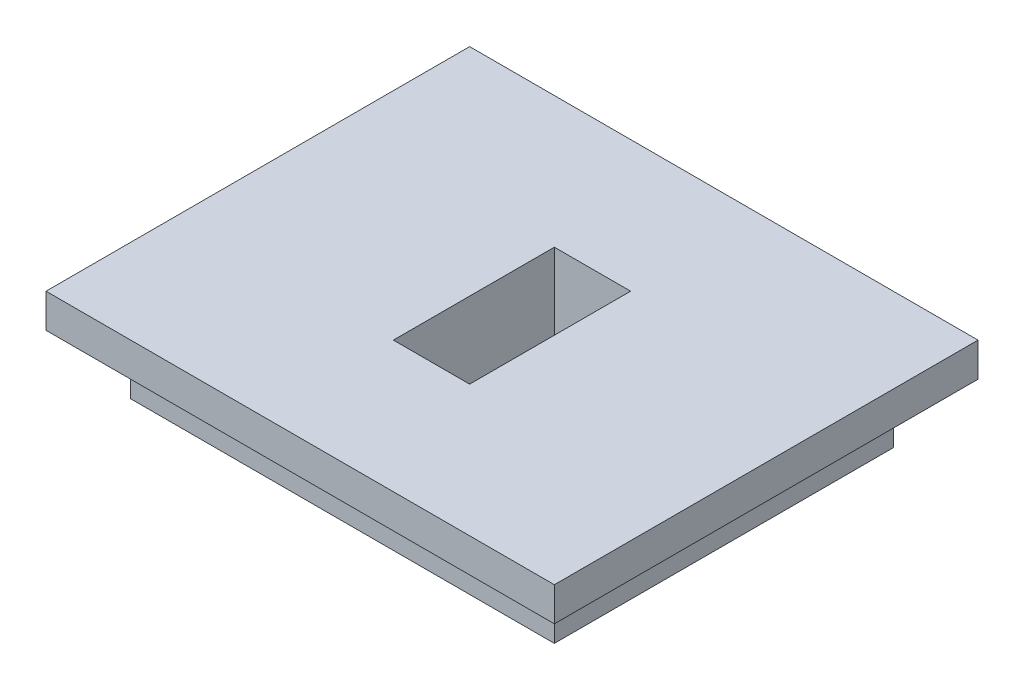
ISO-10303-21;
HEADER;
FILE_DESCRIPTION(('STEP AP214'),'2;1');
FILE_NAME('part.step','',(''),(''),'','','');
FILE_SCHEMA(('AUTOMOTIVE_DESIGN { 1 0 10303 214 1 1 1 1 }'));
ENDSEC;
DATA;
#1=APPLICATION_CONTEXT('core data for automotive mechanical design processes');
#2=APPLICATION_PROTOCOL_DEFINITION('international standard','automotive_design',2000,#1);
#3=PRODUCT_CONTEXT('',#1,'mechanical');
#4=PRODUCT('Part','Part','',(#3));
#5=PRODUCT_RELATED_PRODUCT_CATEGORY('part','',(#4));
#6=PRODUCT_DEFINITION_FORMATION('','',#4);
#7=PRODUCT_DEFINITION_CONTEXT('part definition',#1,'design');
#8=PRODUCT_DEFINITION('design','',#6,#7);
#9=PRODUCT_DEFINITION_SHAPE('','',#8);
#10=(LENGTH_UNIT() NAMED_UNIT(*) SI_UNIT(.MILLI.,.METRE.));
#11=(NAMED_UNIT(*) PLANE_ANGLE_UNIT() SI_UNIT($,.RADIAN.));
#12=(NAMED_UNIT(*) SI_UNIT($,.STERADIAN.) SOLID_ANGLE_UNIT());
#13=UNCERTAINTY_MEASURE_WITH_UNIT(LENGTH_MEASURE(1.E-05),#10,'distance_accuracy_value','');
#14=(GEOMETRIC_REPRESENTATION_CONTEXT(3) GLOBAL_UNCERTAINTY_ASSIGNED_CONTEXT((#13)) GLOBAL_UNIT_ASSIGNED_CONTEXT((#10,
#11,#12)) REPRESENTATION_CONTEXT('',''));
#15=CARTESIAN_POINT('',(0.,0.,0.));
#16=DIRECTION('',(0.,0.,1.));
#17=DIRECTION('',(1.,0.,0.));
#18=AXIS2_PLACEMENT_3D('',#15,#16,#17);
#19=CARTESIAN_POINT('',(0.,0.,0.));
#20=DIRECTION('',(0.,1.,0.));
#21=DIRECTION('',(0.,0.,1.));
#22=AXIS2_PLACEMENT_3D('',#19,#20,#21);
#23=PLANE('',#22);
#24=DIRECTION('',(0.,0.,1.));
#25=VECTOR('',#24,1.);
#26=CARTESIAN_POINT('',(-30.,0.,25.));
#27=LINE('',#26,#25);
#28=CARTESIAN_POINT('',(-30.,0.,-25.));
#29=VERTEX_POINT('',#28);
#30=CARTESIAN_POINT('',(-30.,0.,25.));
#31=VERTEX_POINT('',#30);
#32=EDGE_CURVE('E186',#29,#31,#27,.T.);
#33=ORIENTED_EDGE('',*,*,#32,.F.);
#34=DIRECTION('',(-1.,0.,0.));
#35=VECTOR('',#34,1.);
#36=CARTESIAN_POINT('',(30.,0.,-25.));
#37=LINE('',#36,#35);
#38=CARTESIAN_POINT('',(30.,0.,-25.));
#39=VERTEX_POINT('',#38);
#40=EDGE_CURVE('E191',#39,#29,#37,.T.);
#41=ORIENTED_EDGE('',*,*,#40,.F.);
#42=DIRECTION('',(0.,0.,-1.));
#43=VECTOR('',#42,1.);
#44=CARTESIAN_POINT('',(30.,0.,25.));
#45=LINE('',#44,#43);
#46=CARTESIAN_POINT('',(30.,0.,25.));
#47=VERTEX_POINT('',#46);
#48=EDGE_CURVE('E202',#47,#39,#45,.T.);
#49=ORIENTED_EDGE('',*,*,#48,.F.);
#50=DIRECTION('',(1.,0.,0.));
#51=VECTOR('',#50,1.);
#52=CARTESIAN_POINT('',(30.,0.,25.));
#53=LINE('',#52,#51);
#54=EDGE_CURVE('E200',#31,#47,#53,.T.);
#55=ORIENTED_EDGE('',*,*,#54,.F.);
#56=EDGE_LOOP('',(#33,#41,#49,#55));
#57=FACE_BOUND('',#56,.T.);
#58=DIRECTION('',(0.,0.,1.));
#59=VECTOR('',#58,1.);
#60=CARTESIAN_POINT('',(25.,0.,20.));
#61=LINE('',#60,#59);
#62=CARTESIAN_POINT('',(25.,0.,-20.));
#63=VERTEX_POINT('',#62);
#64=CARTESIAN_POINT('',(25.,0.,20.));
#65=VERTEX_POINT('',#64);
#66=EDGE_CURVE('E151',#63,#65,#61,.T.);
#67=ORIENTED_EDGE('',*,*,#66,.F.);
#68=DIRECTION('',(1.,0.,0.));
#69=VECTOR('',#68,1.);
#70=CARTESIAN_POINT('',(-25.,0.,-20.));
#71=LINE('',#70,#69);
#72=CARTESIAN_POINT('',(-25.,0.,-20.));
#73=VERTEX_POINT('',#72);
#74=EDGE_CURVE('E158',#73,#63,#71,.T.);
#75=ORIENTED_EDGE('',*,*,#74,.F.);
#76=DIRECTION('',(0.,0.,-1.));
#77=VECTOR('',#76,1.);
#78=CARTESIAN_POINT('',(-25.,0.,20.));
#79=LINE('',#78,#77);
#80=CARTESIAN_POINT('',(-25.,0.,20.));
#81=VERTEX_POINT('',#80);
#82=EDGE_CURVE('E170',#81,#73,#79,.T.);
#83=ORIENTED_EDGE('',*,*,#82,.F.);
#84=DIRECTION('',(-1.,0.,0.));
#85=VECTOR('',#84,1.);
#86=CARTESIAN_POINT('',(-25.,0.,20.));
#87=LINE('',#86,#85);
#88=EDGE_CURVE('E167',#65,#81,#87,.T.);
#89=ORIENTED_EDGE('',*,*,#88,.F.);
#90=EDGE_LOOP('',(#67,#75,#83,#89));
#91=FACE_BOUND('',#90,.T.);
#92=ADVANCED_FACE('F37',(#57,#91),#23,.F.);
#93=CARTESIAN_POINT('',(-30.,4.,25.));
#94=DIRECTION('',(1.,0.,0.));
#95=DIRECTION('',(0.,0.,-1.));
#96=AXIS2_PLACEMENT_3D('',#93,#94,#95);
#97=PLANE('',#96);
#98=ORIENTED_EDGE('',*,*,#32,.T.);
#99=DIRECTION('',(0.,-1.,0.));
#100=VECTOR('',#99,1.);
#101=CARTESIAN_POINT('',(-30.,4.,25.));
#102=LINE('',#101,#100);
#103=CARTESIAN_POINT('',(-30.,4.,25.));
#104=VERTEX_POINT('',#103);
#105=EDGE_CURVE('E213',#104,#31,#102,.T.);
#106=ORIENTED_EDGE('',*,*,#105,.F.);
#107=DIRECTION('',(0.,0.,1.));
#108=VECTOR('',#107,1.);
#109=CARTESIAN_POINT('',(-30.,4.,25.));
#110=LINE('',#109,#108);
#111=CARTESIAN_POINT('',(-30.,4.,-25.));
#112=VERTEX_POINT('',#111);
#113=EDGE_CURVE('E187',#112,#104,#110,.T.);
#114=ORIENTED_EDGE('',*,*,#113,.F.);
#115=DIRECTION('',(0.,-1.,0.));
#116=VECTOR('',#115,1.);
#117=CARTESIAN_POINT('',(-30.,4.,-25.));
#118=LINE('',#117,#116);
#119=EDGE_CURVE('E197',#112,#29,#118,.T.);
#120=ORIENTED_EDGE('',*,*,#119,.T.);
#121=EDGE_LOOP('',(#98,#106,#114,#120));
#122=FACE_BOUND('',#121,.T.);
#123=ADVANCED_FACE('F39',(#122),#97,.F.);
#124=CARTESIAN_POINT('',(30.,4.,25.));
#125=DIRECTION('',(0.,0.,-1.));
#126=DIRECTION('',(-1.,0.,0.));
#127=AXIS2_PLACEMENT_3D('',#124,#125,#126);
#128=PLANE('',#127);
#129=ORIENTED_EDGE('',*,*,#54,.T.);
#130=DIRECTION('',(0.,-1.,0.));
#131=VECTOR('',#130,1.);
#132=CARTESIAN_POINT('',(30.,4.,25.));
#133=LINE('',#132,#131);
#134=CARTESIAN_POINT('',(30.,4.,25.));
#135=VERTEX_POINT('',#134);
#136=EDGE_CURVE('E210',#135,#47,#133,.T.);
#137=ORIENTED_EDGE('',*,*,#136,.F.);
#138=DIRECTION('',(1.,0.,0.));
#139=VECTOR('',#138,1.);
#140=CARTESIAN_POINT('',(30.,4.,25.));
#141=LINE('',#140,#139);
#142=EDGE_CURVE('E190',#104,#135,#141,.T.);
#143=ORIENTED_EDGE('',*,*,#142,.F.);
#144=ORIENTED_EDGE('',*,*,#105,.T.);
#145=EDGE_LOOP('',(#129,#137,#143,#144));
#146=FACE_BOUND('',#145,.T.);
#147=ADVANCED_FACE('F243',(#146),#128,.F.);
#148=CARTESIAN_POINT('',(30.,4.,25.));
#149=DIRECTION('',(-1.,0.,0.));
#150=DIRECTION('',(0.,0.,1.));
#151=AXIS2_PLACEMENT_3D('',#148,#149,#150);
#152=PLANE('',#151);
#153=ORIENTED_EDGE('',*,*,#48,.T.);
#154=DIRECTION('',(0.,-1.,0.));
#155=VECTOR('',#154,1.);
#156=CARTESIAN_POINT('',(30.,4.,-25.));
#157=LINE('',#156,#155);
#158=CARTESIAN_POINT('',(30.,4.,-25.));
#159=VERTEX_POINT('',#158);
#160=EDGE_CURVE('E207',#159,#39,#157,.T.);
#161=ORIENTED_EDGE('',*,*,#160,.F.);
#162=DIRECTION('',(0.,0.,-1.));
#163=VECTOR('',#162,1.);
#164=CARTESIAN_POINT('',(30.,4.,25.));
#165=LINE('',#164,#163);
#166=EDGE_CURVE('E193',#135,#159,#165,.T.);
#167=ORIENTED_EDGE('',*,*,#166,.F.);
#168=ORIENTED_EDGE('',*,*,#136,.T.);
#169=EDGE_LOOP('',(#153,#161,#167,#168));
#170=FACE_BOUND('',#169,.T.);
#171=ADVANCED_FACE('F253',(#170),#152,.F.);
#172=CARTESIAN_POINT('',(30.,4.,-25.));
#173=DIRECTION('',(0.,0.,1.));
#174=DIRECTION('',(1.,0.,0.));
#175=AXIS2_PLACEMENT_3D('',#172,#173,#174);
#176=PLANE('',#175);
#177=ORIENTED_EDGE('',*,*,#40,.T.);
#178=ORIENTED_EDGE('',*,*,#119,.F.);
#179=DIRECTION('',(-1.,0.,0.));
#180=VECTOR('',#179,1.);
#181=CARTESIAN_POINT('',(30.,4.,-25.));
#182=LINE('',#181,#180);
#183=EDGE_CURVE('E195',#159,#112,#182,.T.);
#184=ORIENTED_EDGE('',*,*,#183,.F.);
#185=ORIENTED_EDGE('',*,*,#160,.T.);
#186=EDGE_LOOP('',(#177,#178,#184,#185));
#187=FACE_BOUND('',#186,.T.);
#188=ADVANCED_FACE('F250',(#187),#176,.F.);
#189=CARTESIAN_POINT('',(0.,4.,0.));
#190=DIRECTION('',(0.,1.,0.));
#191=DIRECTION('',(0.,0.,1.));
#192=AXIS2_PLACEMENT_3D('',#189,#190,#191);
#193=PLANE('',#192);
#194=DIRECTION('',(0.,0.,1.));
#195=VECTOR('',#194,1.);
#196=CARTESIAN_POINT('',(-4.5,4.,9.5));
#197=LINE('',#196,#195);
#198=CARTESIAN_POINT('',(-4.5,4.,-9.5));
#199=VERTEX_POINT('',#198);
#200=CARTESIAN_POINT('',(-4.5,4.,9.5));
#201=VERTEX_POINT('',#200);
#202=EDGE_CURVE('E52',#199,#201,#197,.T.);
#203=ORIENTED_EDGE('',*,*,#202,.F.);
#204=DIRECTION('',(-1.,0.,0.));
#205=VECTOR('',#204,1.);
#206=CARTESIAN_POINT('',(4.5,4.,-9.5));
#207=LINE('',#206,#205);
#208=CARTESIAN_POINT('',(4.5,4.,-9.5));
#209=VERTEX_POINT('',#208);
#210=EDGE_CURVE('E144',#209,#199,#207,.T.);
#211=ORIENTED_EDGE('',*,*,#210,.F.);
#212=DIRECTION('',(0.,0.,-1.));
#213=VECTOR('',#212,1.);
#214=CARTESIAN_POINT('',(4.5,4.,9.5));
#215=LINE('',#214,#213);
#216=CARTESIAN_POINT('',(4.5,4.,9.5));
#217=VERTEX_POINT('',#216);
#218=EDGE_CURVE('E128',#217,#209,#215,.T.);
#219=ORIENTED_EDGE('',*,*,#218,.F.);
#220=DIRECTION('',(1.,0.,0.));
#221=VECTOR('',#220,1.);
#222=CARTESIAN_POINT('',(4.5,4.,9.5));
#223=LINE('',#222,#221);
#224=EDGE_CURVE('E137',#201,#217,#223,.T.);
#225=ORIENTED_EDGE('',*,*,#224,.F.);
#226=EDGE_LOOP('',(#203,#211,#219,#225));
#227=FACE_BOUND('',#226,.T.);
#228=ORIENTED_EDGE('',*,*,#113,.T.);
#229=ORIENTED_EDGE('',*,*,#142,.T.);
#230=ORIENTED_EDGE('',*,*,#166,.T.);
#231=ORIENTED_EDGE('',*,*,#183,.T.);
#232=EDGE_LOOP('',(#228,#229,#230,#231));
#233=FACE_BOUND('',#232,.T.);
#234=ADVANCED_FACE('F141',(#227,#233),#193,.T.);
#235=CARTESIAN_POINT('',(25.,-7.,20.));
#236=DIRECTION('',(-1.,0.,0.));
#237=DIRECTION('',(0.,0.,1.));
#238=AXIS2_PLACEMENT_3D('',#235,#236,#237);
#239=PLANE('',#238);
#240=ORIENTED_EDGE('',*,*,#66,.T.);
#241=DIRECTION('',(0.,1.,0.));
#242=VECTOR('',#241,1.);
#243=CARTESIAN_POINT('',(25.,-7.,20.));
#244=LINE('',#243,#242);
#245=CARTESIAN_POINT('',(25.,-7.,20.));
#246=VERTEX_POINT('',#245);
#247=EDGE_CURVE('E183',#246,#65,#244,.T.);
#248=ORIENTED_EDGE('',*,*,#247,.F.);
#249=DIRECTION('',(0.,0.,1.));
#250=VECTOR('',#249,1.);
#251=CARTESIAN_POINT('',(25.,-7.,20.));
#252=LINE('',#251,#250);
#253=CARTESIAN_POINT('',(25.,-7.,-20.));
#254=VERTEX_POINT('',#253);
#255=EDGE_CURVE('E154',#254,#246,#252,.T.);
#256=ORIENTED_EDGE('',*,*,#255,.F.);
#257=DIRECTION('',(0.,1.,0.));
#258=VECTOR('',#257,1.);
#259=CARTESIAN_POINT('',(25.,-7.,-20.));
#260=LINE('',#259,#258);
#261=EDGE_CURVE('E164',#254,#63,#260,.T.);
#262=ORIENTED_EDGE('',*,*,#261,.T.);
#263=EDGE_LOOP('',(#240,#248,#256,#262));
#264=FACE_BOUND('',#263,.T.);
#265=ADVANCED_FACE('F271',(#264),#239,.F.);
#266=CARTESIAN_POINT('',(-25.,-7.,20.));
#267=DIRECTION('',(0.,0.,-1.));
#268=DIRECTION('',(-1.,0.,0.));
#269=AXIS2_PLACEMENT_3D('',#266,#267,#268);
#270=PLANE('',#269);
#271=ORIENTED_EDGE('',*,*,#88,.T.);
#272=DIRECTION('',(0.,1.,0.));
#273=VECTOR('',#272,1.);
#274=CARTESIAN_POINT('',(-25.,-7.,20.));
#275=LINE('',#274,#273);
#276=CARTESIAN_POINT('',(-25.,-7.,20.));
#277=VERTEX_POINT('',#276);
#278=EDGE_CURVE('E180',#277,#81,#275,.T.);
#279=ORIENTED_EDGE('',*,*,#278,.F.);
#280=DIRECTION('',(-1.,0.,0.));
#281=VECTOR('',#280,1.);
#282=CARTESIAN_POINT('',(-25.,-7.,20.));
#283=LINE('',#282,#281);
#284=EDGE_CURVE('E157',#246,#277,#283,.T.);
#285=ORIENTED_EDGE('',*,*,#284,.F.);
#286=ORIENTED_EDGE('',*,*,#247,.T.);
#287=EDGE_LOOP('',(#271,#279,#285,#286));
#288=FACE_BOUND('',#287,.T.);
#289=ADVANCED_FACE('F275',(#288),#270,.F.);
#290=CARTESIAN_POINT('',(-25.,-7.,20.));
#291=DIRECTION('',(1.,0.,0.));
#292=DIRECTION('',(0.,0.,-1.));
#293=AXIS2_PLACEMENT_3D('',#290,#291,#292);
#294=PLANE('',#293);
#295=ORIENTED_EDGE('',*,*,#82,.T.);
#296=DIRECTION('',(0.,1.,0.));
#297=VECTOR('',#296,1.);
#298=CARTESIAN_POINT('',(-25.,-7.,-20.));
#299=LINE('',#298,#297);
#300=CARTESIAN_POINT('',(-25.,-7.,-20.));
#301=VERTEX_POINT('',#300);
#302=EDGE_CURVE('E177',#301,#73,#299,.T.);
#303=ORIENTED_EDGE('',*,*,#302,.F.);
#304=DIRECTION('',(0.,0.,-1.));
#305=VECTOR('',#304,1.);
#306=CARTESIAN_POINT('',(-25.,-7.,20.));
#307=LINE('',#306,#305);
#308=EDGE_CURVE('E160',#277,#301,#307,.T.);
#309=ORIENTED_EDGE('',*,*,#308,.F.);
#310=ORIENTED_EDGE('',*,*,#278,.T.);
#311=EDGE_LOOP('',(#295,#303,#309,#310));
#312=FACE_BOUND('',#311,.T.);
#313=ADVANCED_FACE('F280',(#312),#294,.F.);
#314=CARTESIAN_POINT('',(-25.,-7.,-20.));
#315=DIRECTION('',(0.,0.,1.));
#316=DIRECTION('',(1.,0.,0.));
#317=AXIS2_PLACEMENT_3D('',#314,#315,#316);
#318=PLANE('',#317);
#319=ORIENTED_EDGE('',*,*,#74,.T.);
#320=ORIENTED_EDGE('',*,*,#261,.F.);
#321=DIRECTION('',(1.,0.,0.));
#322=VECTOR('',#321,1.);
#323=CARTESIAN_POINT('',(-25.,-7.,-20.));
#324=LINE('',#323,#322);
#325=EDGE_CURVE('E162',#301,#254,#324,.T.);
#326=ORIENTED_EDGE('',*,*,#325,.F.);
#327=ORIENTED_EDGE('',*,*,#302,.T.);
#328=EDGE_LOOP('',(#319,#320,#326,#327));
#329=FACE_BOUND('',#328,.T.);
#330=ADVANCED_FACE('F234',(#329),#318,.F.);
#331=CARTESIAN_POINT('',(0.,-7.,0.));
#332=DIRECTION('',(0.,-1.,0.));
#333=DIRECTION('',(0.,0.,-1.));
#334=AXIS2_PLACEMENT_3D('',#331,#332,#333);
#335=PLANE('',#334);
#336=DIRECTION('',(0.,0.,-1.));
#337=VECTOR('',#336,1.);
#338=CARTESIAN_POINT('',(-4.5,-7.,0.));
#339=LINE('',#338,#337);
#340=CARTESIAN_POINT('',(-4.5,-7.,9.5));
#341=VERTEX_POINT('',#340);
#342=CARTESIAN_POINT('',(-4.5,-7.,-9.5));
#343=VERTEX_POINT('',#342);
#344=EDGE_CURVE('E11',#341,#343,#339,.T.);
#345=ORIENTED_EDGE('',*,*,#344,.F.);
#346=DIRECTION('',(-1.,0.,0.));
#347=VECTOR('',#346,1.);
#348=CARTESIAN_POINT('',(0.,-7.,9.5));
#349=LINE('',#348,#347);
#350=CARTESIAN_POINT('',(4.5,-7.,9.5));
#351=VERTEX_POINT('',#350);
#352=EDGE_CURVE('E216',#351,#341,#349,.T.);
#353=ORIENTED_EDGE('',*,*,#352,.F.);
#354=DIRECTION('',(0.,0.,1.));
#355=VECTOR('',#354,1.);
#356=CARTESIAN_POINT('',(4.5,-7.,0.));
#357=LINE('',#356,#355);
#358=CARTESIAN_POINT('',(4.5,-7.,-9.5));
#359=VERTEX_POINT('',#358);
#360=EDGE_CURVE('E131',#359,#351,#357,.T.);
#361=ORIENTED_EDGE('',*,*,#360,.F.);
#362=DIRECTION('',(1.,0.,0.));
#363=VECTOR('',#362,1.);
#364=CARTESIAN_POINT('',(0.,-7.,-9.5));
#365=LINE('',#364,#363);
#366=EDGE_CURVE('E45',#343,#359,#365,.T.);
#367=ORIENTED_EDGE('',*,*,#366,.F.);
#368=EDGE_LOOP('',(#345,#353,#361,#367));
#369=FACE_BOUND('',#368,.T.);
#370=ORIENTED_EDGE('',*,*,#255,.T.);
#371=ORIENTED_EDGE('',*,*,#284,.T.);
#372=ORIENTED_EDGE('',*,*,#308,.T.);
#373=ORIENTED_EDGE('',*,*,#325,.T.);
#374=EDGE_LOOP('',(#370,#371,#372,#373));
#375=FACE_BOUND('',#374,.T.);
#376=ADVANCED_FACE('F224',(#369,#375),#335,.T.);
#377=CARTESIAN_POINT('',(-4.5,-10.,9.5));
#378=DIRECTION('',(-1.,0.,0.));
#379=DIRECTION('',(0.,0.,1.));
#380=AXIS2_PLACEMENT_3D('',#377,#378,#379);
#381=PLANE('',#380);
#382=ORIENTED_EDGE('',*,*,#344,.T.);
#383=DIRECTION('',(0.,1.,0.));
#384=VECTOR('',#383,1.);
#385=CARTESIAN_POINT('',(-4.5,-10.,-9.5));
#386=LINE('',#385,#384);
#387=EDGE_CURVE('E149',#343,#199,#386,.T.);
#388=ORIENTED_EDGE('',*,*,#387,.T.);
#389=ORIENTED_EDGE('',*,*,#202,.T.);
#390=DIRECTION('',(0.,1.,0.));
#391=VECTOR('',#390,1.);
#392=CARTESIAN_POINT('',(-4.5,-10.,9.5));
#393=LINE('',#392,#391);
#394=EDGE_CURVE('E134',#341,#201,#393,.T.);
#395=ORIENTED_EDGE('',*,*,#394,.F.);
#396=EDGE_LOOP('',(#382,#388,#389,#395));
#397=FACE_BOUND('',#396,.T.);
#398=ADVANCED_FACE('F226',(#397),#381,.F.);
#399=CARTESIAN_POINT('',(4.5,-10.,-9.5));
#400=DIRECTION('',(0.,0.,-1.));
#401=DIRECTION('',(-1.,0.,0.));
#402=AXIS2_PLACEMENT_3D('',#399,#400,#401);
#403=PLANE('',#402);
#404=ORIENTED_EDGE('',*,*,#366,.T.);
#405=DIRECTION('',(0.,1.,0.));
#406=VECTOR('',#405,1.);
#407=CARTESIAN_POINT('',(4.5,-10.,-9.5));
#408=LINE('',#407,#406);
#409=EDGE_CURVE('E133',#359,#209,#408,.T.);
#410=ORIENTED_EDGE('',*,*,#409,.T.);
#411=ORIENTED_EDGE('',*,*,#210,.T.);
#412=ORIENTED_EDGE('',*,*,#387,.F.);
#413=EDGE_LOOP('',(#404,#410,#411,#412));
#414=FACE_BOUND('',#413,.T.);
#415=ADVANCED_FACE('F221',(#414),#403,.F.);
#416=CARTESIAN_POINT('',(4.5,-10.,9.5));
#417=DIRECTION('',(1.,0.,0.));
#418=DIRECTION('',(0.,0.,-1.));
#419=AXIS2_PLACEMENT_3D('',#416,#417,#418);
#420=PLANE('',#419);
#421=ORIENTED_EDGE('',*,*,#360,.T.);
#422=DIRECTION('',(0.,1.,0.));
#423=VECTOR('',#422,1.);
#424=CARTESIAN_POINT('',(4.5,-10.,9.5));
#425=LINE('',#424,#423);
#426=EDGE_CURVE('E60',#351,#217,#425,.T.);
#427=ORIENTED_EDGE('',*,*,#426,.T.);
#428=ORIENTED_EDGE('',*,*,#218,.T.);
#429=ORIENTED_EDGE('',*,*,#409,.F.);
#430=EDGE_LOOP('',(#421,#427,#428,#429));
#431=FACE_BOUND('',#430,.T.);
#432=ADVANCED_FACE('F125',(#431),#420,.F.);
#433=CARTESIAN_POINT('',(4.5,-10.,9.5));
#434=DIRECTION('',(0.,0.,1.));
#435=DIRECTION('',(1.,0.,0.));
#436=AXIS2_PLACEMENT_3D('',#433,#434,#435);
#437=PLANE('',#436);
#438=ORIENTED_EDGE('',*,*,#352,.T.);
#439=ORIENTED_EDGE('',*,*,#394,.T.);
#440=ORIENTED_EDGE('',*,*,#224,.T.);
#441=ORIENTED_EDGE('',*,*,#426,.F.);
#442=EDGE_LOOP('',(#438,#439,#440,#441));
#443=FACE_BOUND('',#442,.T.);
#444=ADVANCED_FACE('F138',(#443),#437,.F.);
#445=CLOSED_SHELL('',(#92,#123,#147,#171,#188,#234,#265,#289,#313,#330,#376,#398,#415,#432,#444));
#446=MANIFOLD_SOLID_BREP('B2',#445);
#447=ADVANCED_BREP_SHAPE_REPRESENTATION('',(#18,#446),#14);
#448=SHAPE_DEFINITION_REPRESENTATION(#9,#447);
ENDSEC;
END-ISO-10303-21;
